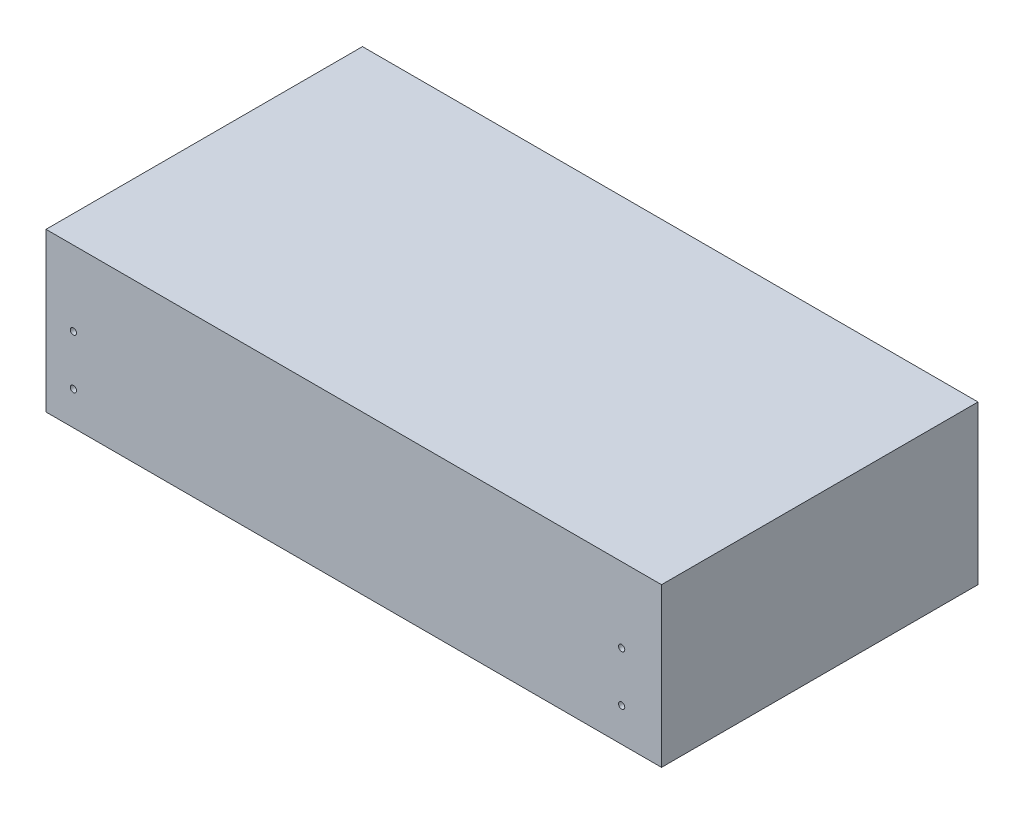
ISO-10303-21;
HEADER;
FILE_DESCRIPTION(('STEP AP214'),'2;1');
FILE_NAME('part.step','',(''),(''),'','','');
FILE_SCHEMA(('AUTOMOTIVE_DESIGN { 1 0 10303 214 1 1 1 1 }'));
ENDSEC;
DATA;
#1=APPLICATION_CONTEXT('core data for automotive mechanical design processes');
#2=APPLICATION_PROTOCOL_DEFINITION('international standard','automotive_design',2000,#1);
#3=PRODUCT_CONTEXT('',#1,'mechanical');
#4=PRODUCT('Part','Part','',(#3));
#5=PRODUCT_RELATED_PRODUCT_CATEGORY('part','',(#4));
#6=PRODUCT_DEFINITION_FORMATION('','',#4);
#7=PRODUCT_DEFINITION_CONTEXT('part definition',#1,'design');
#8=PRODUCT_DEFINITION('design','',#6,#7);
#9=PRODUCT_DEFINITION_SHAPE('','',#8);
#10=(LENGTH_UNIT() NAMED_UNIT(*) SI_UNIT(.MILLI.,.METRE.));
#11=(NAMED_UNIT(*) PLANE_ANGLE_UNIT() SI_UNIT($,.RADIAN.));
#12=(NAMED_UNIT(*) SI_UNIT($,.STERADIAN.) SOLID_ANGLE_UNIT());
#13=UNCERTAINTY_MEASURE_WITH_UNIT(LENGTH_MEASURE(1.E-05),#10,'distance_accuracy_value','');
#14=(GEOMETRIC_REPRESENTATION_CONTEXT(3) GLOBAL_UNCERTAINTY_ASSIGNED_CONTEXT((#13)) GLOBAL_UNIT_ASSIGNED_CONTEXT((#10,
#11,#12)) REPRESENTATION_CONTEXT('',''));
#15=CARTESIAN_POINT('',(0.,0.,0.));
#16=DIRECTION('',(0.,0.,1.));
#17=DIRECTION('',(1.,0.,0.));
#18=AXIS2_PLACEMENT_3D('',#15,#16,#17);
#19=CARTESIAN_POINT('',(-128.5,0.,0.));
#20=DIRECTION('',(1.,0.,0.));
#21=DIRECTION('',(0.,0.,-1.));
#22=AXIS2_PLACEMENT_3D('',#19,#20,#21);
#23=PLANE('',#22);
#24=DIRECTION('',(0.,-1.,0.));
#25=VECTOR('',#24,1.);
#26=CARTESIAN_POINT('',(-128.5,18.35,41.0916666666667));
#27=LINE('',#26,#25);
#28=CARTESIAN_POINT('',(-128.5,18.35,41.0916666666667));
#29=VERTEX_POINT('',#28);
#30=CARTESIAN_POINT('',(-128.5,12.,41.0916666666667));
#31=VERTEX_POINT('',#30);
#32=EDGE_CURVE('E218',#29,#31,#27,.T.);
#33=ORIENTED_EDGE('',*,*,#32,.F.);
#34=DIRECTION('',(0.,0.,-1.));
#35=VECTOR('',#34,1.);
#36=CARTESIAN_POINT('',(-128.5,18.35,29.45));
#37=LINE('',#36,#35);
#38=CARTESIAN_POINT('',(-128.5,18.35,36.8583333333334));
#39=VERTEX_POINT('',#38);
#40=EDGE_CURVE('E297',#29,#39,#37,.T.);
#41=ORIENTED_EDGE('',*,*,#40,.T.);
#42=DIRECTION('',(0.,1.,0.));
#43=VECTOR('',#42,1.);
#44=CARTESIAN_POINT('',(-128.5,18.35,36.8583333333334));
#45=LINE('',#44,#43);
#46=CARTESIAN_POINT('',(-128.5,12.,36.8583333333334));
#47=VERTEX_POINT('',#46);
#48=EDGE_CURVE('E248',#47,#39,#45,.T.);
#49=ORIENTED_EDGE('',*,*,#48,.F.);
#50=DIRECTION('',(0.,0.,1.));
#51=VECTOR('',#50,1.);
#52=CARTESIAN_POINT('',(-128.5,12.,29.45));
#53=LINE('',#52,#51);
#54=EDGE_CURVE('E57',#47,#31,#53,.T.);
#55=ORIENTED_EDGE('',*,*,#54,.T.);
#56=EDGE_LOOP('',(#33,#41,#49,#55));
#57=FACE_BOUND('',#56,.T.);
#58=ADVANCED_FACE('F34',(#57),#23,.F.);
#59=DIRECTION('',(0.,1.,0.));
#60=VECTOR('',#59,1.);
#61=CARTESIAN_POINT('',(-128.5,18.35,42.6791666666667));
#62=LINE('',#61,#60);
#63=CARTESIAN_POINT('',(-128.5,12.,42.6791666666667));
#64=VERTEX_POINT('',#63);
#65=CARTESIAN_POINT('',(-128.5,18.35,42.6791666666667));
#66=VERTEX_POINT('',#65);
#67=EDGE_CURVE('E49',#64,#66,#62,.T.);
#68=ORIENTED_EDGE('',*,*,#67,.F.);
#69=CARTESIAN_POINT('',(-128.5,12.,46.9125));
#70=VERTEX_POINT('',#69);
#71=EDGE_CURVE('E293',#64,#70,#53,.T.);
#72=ORIENTED_EDGE('',*,*,#71,.T.);
#73=DIRECTION('',(0.,-1.,0.));
#74=VECTOR('',#73,1.);
#75=CARTESIAN_POINT('',(-128.5,18.35,46.9125));
#76=LINE('',#75,#74);
#77=CARTESIAN_POINT('',(-128.5,18.35,46.9125));
#78=VERTEX_POINT('',#77);
#79=EDGE_CURVE('E219',#78,#70,#76,.T.);
#80=ORIENTED_EDGE('',*,*,#79,.F.);
#81=EDGE_CURVE('E294',#78,#66,#37,.T.);
#82=ORIENTED_EDGE('',*,*,#81,.T.);
#83=EDGE_LOOP('',(#68,#72,#80,#82));
#84=FACE_BOUND('',#83,.T.);
#85=ADVANCED_FACE('F424',(#84),#23,.F.);
#86=DIRECTION('',(0.,-1.,0.));
#87=VECTOR('',#86,1.);
#88=CARTESIAN_POINT('',(-128.5,18.35,35.2708333333334));
#89=LINE('',#88,#87);
#90=CARTESIAN_POINT('',(-128.5,18.35,35.2708333333334));
#91=VERTEX_POINT('',#90);
#92=CARTESIAN_POINT('',(-128.5,12.,35.2708333333334));
#93=VERTEX_POINT('',#92);
#94=EDGE_CURVE('E243',#91,#93,#89,.T.);
#95=ORIENTED_EDGE('',*,*,#94,.F.);
#96=CARTESIAN_POINT('',(-128.5,18.35,31.0375));
#97=VERTEX_POINT('',#96);
#98=EDGE_CURVE('E292',#91,#97,#37,.T.);
#99=ORIENTED_EDGE('',*,*,#98,.T.);
#100=DIRECTION('',(0.,1.,0.));
#101=VECTOR('',#100,1.);
#102=CARTESIAN_POINT('',(-128.5,18.35,31.0375));
#103=LINE('',#102,#101);
#104=CARTESIAN_POINT('',(-128.5,12.,31.0375));
#105=VERTEX_POINT('',#104);
#106=EDGE_CURVE('E270',#105,#97,#103,.T.);
#107=ORIENTED_EDGE('',*,*,#106,.F.);
#108=EDGE_CURVE('E290',#105,#93,#53,.T.);
#109=ORIENTED_EDGE('',*,*,#108,.T.);
#110=EDGE_LOOP('',(#95,#99,#107,#109));
#111=FACE_BOUND('',#110,.T.);
#112=ADVANCED_FACE('F420',(#111),#23,.F.);
#113=CARTESIAN_POINT('',(-123.5,63.5,63.5));
#114=DIRECTION('',(1.,0.,0.));
#115=DIRECTION('',(0.,0.,-1.));
#116=AXIS2_PLACEMENT_3D('',#113,#114,#115);
#117=PLANE('',#116);
#118=DIRECTION('',(0.,0.,1.));
#119=VECTOR('',#118,1.);
#120=CARTESIAN_POINT('',(-123.5,0.,63.5));
#121=LINE('',#120,#119);
#122=CARTESIAN_POINT('',(-123.5,0.,-63.5));
#123=VERTEX_POINT('',#122);
#124=CARTESIAN_POINT('',(-123.5,0.,63.5));
#125=VERTEX_POINT('',#124);
#126=EDGE_CURVE('E367',#123,#125,#121,.T.);
#127=ORIENTED_EDGE('',*,*,#126,.T.);
#128=DIRECTION('',(0.,-1.,0.));
#129=VECTOR('',#128,1.);
#130=CARTESIAN_POINT('',(-123.5,63.5,63.5));
#131=LINE('',#130,#129);
#132=CARTESIAN_POINT('',(-123.5,63.5,63.5));
#133=VERTEX_POINT('',#132);
#134=EDGE_CURVE('E11',#133,#125,#131,.T.);
#135=ORIENTED_EDGE('',*,*,#134,.F.);
#136=DIRECTION('',(0.,0.,1.));
#137=VECTOR('',#136,1.);
#138=CARTESIAN_POINT('',(-123.5,63.5,63.5));
#139=LINE('',#138,#137);
#140=CARTESIAN_POINT('',(-123.5,63.5,-63.5));
#141=VERTEX_POINT('',#140);
#142=EDGE_CURVE('E368',#141,#133,#139,.T.);
#143=ORIENTED_EDGE('',*,*,#142,.F.);
#144=DIRECTION('',(0.,-1.,0.));
#145=VECTOR('',#144,1.);
#146=CARTESIAN_POINT('',(-123.5,63.5,-63.5));
#147=LINE('',#146,#145);
#148=EDGE_CURVE('E378',#141,#123,#147,.T.);
#149=ORIENTED_EDGE('',*,*,#148,.T.);
#150=EDGE_LOOP('',(#127,#135,#143,#149));
#151=FACE_BOUND('',#150,.T.);
#152=DIRECTION('',(0.,-1.,0.));
#153=VECTOR('',#152,1.);
#154=CARTESIAN_POINT('',(-123.5,12.,29.45));
#155=LINE('',#154,#153);
#156=CARTESIAN_POINT('',(-123.5,18.35,29.45));
#157=VERTEX_POINT('',#156);
#158=CARTESIAN_POINT('',(-123.5,12.,29.45));
#159=VERTEX_POINT('',#158);
#160=EDGE_CURVE('E289',#157,#159,#155,.T.);
#161=ORIENTED_EDGE('',*,*,#160,.F.);
#162=DIRECTION('',(0.,0.,-1.));
#163=VECTOR('',#162,1.);
#164=CARTESIAN_POINT('',(-123.5,18.35,29.45));
#165=LINE('',#164,#163);
#166=CARTESIAN_POINT('',(-123.5,18.35,48.5));
#167=VERTEX_POINT('',#166);
#168=EDGE_CURVE('E305',#167,#157,#165,.T.);
#169=ORIENTED_EDGE('',*,*,#168,.F.);
#170=DIRECTION('',(0.,1.,0.));
#171=VECTOR('',#170,1.);
#172=CARTESIAN_POINT('',(-123.5,12.,48.5));
#173=LINE('',#172,#171);
#174=CARTESIAN_POINT('',(-123.5,12.,48.5));
#175=VERTEX_POINT('',#174);
#176=EDGE_CURVE('E302',#175,#167,#173,.T.);
#177=ORIENTED_EDGE('',*,*,#176,.F.);
#178=DIRECTION('',(0.,0.,1.));
#179=VECTOR('',#178,1.);
#180=CARTESIAN_POINT('',(-123.5,12.,29.45));
#181=LINE('',#180,#179);
#182=EDGE_CURVE('E300',#159,#175,#181,.T.);
#183=ORIENTED_EDGE('',*,*,#182,.F.);
#184=EDGE_LOOP('',(#161,#169,#177,#183));
#185=FACE_BOUND('',#184,.T.);
#186=ADVANCED_FACE('F36',(#151,#185),#117,.F.);
#187=CARTESIAN_POINT('',(-123.5,63.5,63.5));
#188=DIRECTION('',(0.,0.,-1.));
#189=DIRECTION('',(-1.,0.,0.));
#190=AXIS2_PLACEMENT_3D('',#187,#188,#189);
#191=PLANE('',#190);
#192=CARTESIAN_POINT('',(-112.5,33.5,63.5));
#193=DIRECTION('',(0.,0.,1.));
#194=DIRECTION('',(1.,0.,0.));
#195=AXIS2_PLACEMENT_3D('',#192,#193,#194);
#196=CIRCLE('',#195,1.24999999999999);
#197=CARTESIAN_POINT('',(-111.25,33.5,63.5));
#198=VERTEX_POINT('',#197);
#199=EDGE_CURVE('E343',#198,#198,#196,.T.);
#200=ORIENTED_EDGE('',*,*,#199,.F.);
#201=EDGE_LOOP('',(#200));
#202=FACE_BOUND('',#201,.T.);
#203=CARTESIAN_POINT('',(-112.5,13.5,63.5));
#204=DIRECTION('',(0.,0.,1.));
#205=DIRECTION('',(1.,0.,0.));
#206=AXIS2_PLACEMENT_3D('',#203,#204,#205);
#207=CIRCLE('',#206,1.24999999999999);
#208=CARTESIAN_POINT('',(-111.25,13.5,63.5));
#209=VERTEX_POINT('',#208);
#210=EDGE_CURVE('E349',#209,#209,#207,.T.);
#211=ORIENTED_EDGE('',*,*,#210,.F.);
#212=EDGE_LOOP('',(#211));
#213=FACE_BOUND('',#212,.T.);
#214=CARTESIAN_POINT('',(107.5,13.5,63.5));
#215=DIRECTION('',(0.,0.,1.));
#216=DIRECTION('',(1.,0.,0.));
#217=AXIS2_PLACEMENT_3D('',#214,#215,#216);
#218=CIRCLE('',#217,1.24999999999999);
#219=CARTESIAN_POINT('',(108.75,13.5,63.5));
#220=VERTEX_POINT('',#219);
#221=EDGE_CURVE('E355',#220,#220,#218,.T.);
#222=ORIENTED_EDGE('',*,*,#221,.F.);
#223=EDGE_LOOP('',(#222));
#224=FACE_BOUND('',#223,.T.);
#225=CARTESIAN_POINT('',(107.5,33.5,63.5));
#226=DIRECTION('',(0.,0.,1.));
#227=DIRECTION('',(1.,0.,0.));
#228=AXIS2_PLACEMENT_3D('',#225,#226,#227);
#229=CIRCLE('',#228,1.24999999999999);
#230=CARTESIAN_POINT('',(108.75,33.5,63.5));
#231=VERTEX_POINT('',#230);
#232=EDGE_CURVE('E361',#231,#231,#229,.T.);
#233=ORIENTED_EDGE('',*,*,#232,.F.);
#234=EDGE_LOOP('',(#233));
#235=FACE_BOUND('',#234,.T.);
#236=DIRECTION('',(1.,0.,0.));
#237=VECTOR('',#236,1.);
#238=CARTESIAN_POINT('',(-123.5,0.,63.5));
#239=LINE('',#238,#237);
#240=CARTESIAN_POINT('',(123.5,0.,63.5));
#241=VERTEX_POINT('',#240);
#242=EDGE_CURVE('E381',#125,#241,#239,.T.);
#243=ORIENTED_EDGE('',*,*,#242,.T.);
#244=DIRECTION('',(0.,-1.,0.));
#245=VECTOR('',#244,1.);
#246=CARTESIAN_POINT('',(123.5,63.5,63.5));
#247=LINE('',#246,#245);
#248=CARTESIAN_POINT('',(123.5,63.5,63.5));
#249=VERTEX_POINT('',#248);
#250=EDGE_CURVE('E42',#249,#241,#247,.T.);
#251=ORIENTED_EDGE('',*,*,#250,.F.);
#252=DIRECTION('',(1.,0.,0.));
#253=VECTOR('',#252,1.);
#254=CARTESIAN_POINT('',(-123.5,63.5,63.5));
#255=LINE('',#254,#253);
#256=EDGE_CURVE('E371',#133,#249,#255,.T.);
#257=ORIENTED_EDGE('',*,*,#256,.F.);
#258=ORIENTED_EDGE('',*,*,#134,.T.);
#259=EDGE_LOOP('',(#243,#251,#257,#258));
#260=FACE_BOUND('',#259,.T.);
#261=ADVANCED_FACE('F412',(#202,#213,#224,#235,#260),#191,.F.);
#262=CARTESIAN_POINT('',(123.5,63.5,63.5));
#263=DIRECTION('',(-1.,0.,0.));
#264=DIRECTION('',(0.,0.,1.));
#265=AXIS2_PLACEMENT_3D('',#262,#263,#264);
#266=PLANE('',#265);
#267=DIRECTION('',(0.,0.,-1.));
#268=VECTOR('',#267,1.);
#269=CARTESIAN_POINT('',(123.5,0.,63.5));
#270=LINE('',#269,#268);
#271=CARTESIAN_POINT('',(123.5,0.,-63.5));
#272=VERTEX_POINT('',#271);
#273=EDGE_CURVE('E383',#241,#272,#270,.T.);
#274=ORIENTED_EDGE('',*,*,#273,.T.);
#275=DIRECTION('',(0.,-1.,0.));
#276=VECTOR('',#275,1.);
#277=CARTESIAN_POINT('',(123.5,63.5,-63.5));
#278=LINE('',#277,#276);
#279=CARTESIAN_POINT('',(123.5,63.5,-63.5));
#280=VERTEX_POINT('',#279);
#281=EDGE_CURVE('E388',#280,#272,#278,.T.);
#282=ORIENTED_EDGE('',*,*,#281,.F.);
#283=DIRECTION('',(0.,0.,-1.));
#284=VECTOR('',#283,1.);
#285=CARTESIAN_POINT('',(123.5,63.5,63.5));
#286=LINE('',#285,#284);
#287=EDGE_CURVE('E374',#249,#280,#286,.T.);
#288=ORIENTED_EDGE('',*,*,#287,.F.);
#289=ORIENTED_EDGE('',*,*,#250,.T.);
#290=EDGE_LOOP('',(#274,#282,#288,#289));
#291=FACE_BOUND('',#290,.T.);
#292=ADVANCED_FACE('F395',(#291),#266,.F.);
#293=CARTESIAN_POINT('',(-123.5,63.5,-63.5));
#294=DIRECTION('',(0.,0.,1.));
#295=DIRECTION('',(1.,0.,0.));
#296=AXIS2_PLACEMENT_3D('',#293,#294,#295);
#297=PLANE('',#296);
#298=CARTESIAN_POINT('',(-112.5,33.5,-63.5));
#299=DIRECTION('',(0.,0.,-1.));
#300=DIRECTION('',(-1.,0.,0.));
#301=AXIS2_PLACEMENT_3D('',#298,#299,#300);
#302=CIRCLE('',#301,1.24999999999999);
#303=CARTESIAN_POINT('',(-113.75,33.5,-63.5));
#304=VERTEX_POINT('',#303);
#305=EDGE_CURVE('E319',#304,#304,#302,.T.);
#306=ORIENTED_EDGE('',*,*,#305,.F.);
#307=EDGE_LOOP('',(#306));
#308=FACE_BOUND('',#307,.T.);
#309=CARTESIAN_POINT('',(-112.5,13.5,-63.5));
#310=DIRECTION('',(0.,0.,-1.));
#311=DIRECTION('',(-1.,0.,0.));
#312=AXIS2_PLACEMENT_3D('',#309,#310,#311);
#313=CIRCLE('',#312,1.24999999999999);
#314=CARTESIAN_POINT('',(-113.75,13.5,-63.5));
#315=VERTEX_POINT('',#314);
#316=EDGE_CURVE('E325',#315,#315,#313,.T.);
#317=ORIENTED_EDGE('',*,*,#316,.F.);
#318=EDGE_LOOP('',(#317));
#319=FACE_BOUND('',#318,.T.);
#320=CARTESIAN_POINT('',(107.5,13.5,-63.5));
#321=DIRECTION('',(0.,0.,-1.));
#322=DIRECTION('',(-1.,0.,0.));
#323=AXIS2_PLACEMENT_3D('',#320,#321,#322);
#324=CIRCLE('',#323,1.24999999999999);
#325=CARTESIAN_POINT('',(106.25,13.5,-63.5));
#326=VERTEX_POINT('',#325);
#327=EDGE_CURVE('E331',#326,#326,#324,.T.);
#328=ORIENTED_EDGE('',*,*,#327,.F.);
#329=EDGE_LOOP('',(#328));
#330=FACE_BOUND('',#329,.T.);
#331=CARTESIAN_POINT('',(107.5,33.5,-63.5));
#332=DIRECTION('',(0.,0.,-1.));
#333=DIRECTION('',(-1.,0.,0.));
#334=AXIS2_PLACEMENT_3D('',#331,#332,#333);
#335=CIRCLE('',#334,1.24999999999999);
#336=CARTESIAN_POINT('',(106.25,33.5,-63.5));
#337=VERTEX_POINT('',#336);
#338=EDGE_CURVE('E337',#337,#337,#335,.T.);
#339=ORIENTED_EDGE('',*,*,#338,.F.);
#340=EDGE_LOOP('',(#339));
#341=FACE_BOUND('',#340,.T.);
#342=DIRECTION('',(-1.,0.,0.));
#343=VECTOR('',#342,1.);
#344=CARTESIAN_POINT('',(-123.5,0.,-63.5));
#345=LINE('',#344,#343);
#346=EDGE_CURVE('E372',#272,#123,#345,.T.);
#347=ORIENTED_EDGE('',*,*,#346,.T.);
#348=ORIENTED_EDGE('',*,*,#148,.F.);
#349=DIRECTION('',(-1.,0.,0.));
#350=VECTOR('',#349,1.);
#351=CARTESIAN_POINT('',(-123.5,63.5,-63.5));
#352=LINE('',#351,#350);
#353=EDGE_CURVE('E376',#280,#141,#352,.T.);
#354=ORIENTED_EDGE('',*,*,#353,.F.);
#355=ORIENTED_EDGE('',*,*,#281,.T.);
#356=EDGE_LOOP('',(#347,#348,#354,#355));
#357=FACE_BOUND('',#356,.T.);
#358=ADVANCED_FACE('F404',(#308,#319,#330,#341,#357),#297,.F.);
#359=CARTESIAN_POINT('',(0.,63.5,0.));
#360=DIRECTION('',(0.,-1.,0.));
#361=DIRECTION('',(0.,0.,-1.));
#362=AXIS2_PLACEMENT_3D('',#359,#360,#361);
#363=PLANE('',#362);
#364=ORIENTED_EDGE('',*,*,#142,.T.);
#365=ORIENTED_EDGE('',*,*,#256,.T.);
#366=ORIENTED_EDGE('',*,*,#287,.T.);
#367=ORIENTED_EDGE('',*,*,#353,.T.);
#368=EDGE_LOOP('',(#364,#365,#366,#367));
#369=FACE_BOUND('',#368,.T.);
#370=ADVANCED_FACE('F411',(#369),#363,.F.);
#371=CARTESIAN_POINT('',(0.,0.,0.));
#372=DIRECTION('',(0.,-1.,0.));
#373=DIRECTION('',(0.,0.,-1.));
#374=AXIS2_PLACEMENT_3D('',#371,#372,#373);
#375=PLANE('',#374);
#376=ORIENTED_EDGE('',*,*,#126,.F.);
#377=ORIENTED_EDGE('',*,*,#346,.F.);
#378=ORIENTED_EDGE('',*,*,#273,.F.);
#379=ORIENTED_EDGE('',*,*,#242,.F.);
#380=EDGE_LOOP('',(#376,#377,#378,#379));
#381=FACE_BOUND('',#380,.T.);
#382=ADVANCED_FACE('F401',(#381),#375,.T.);
#383=CARTESIAN_POINT('',(107.5,33.5,59.5));
#384=DIRECTION('',(0.,0.,1.));
#385=DIRECTION('',(1.,0.,0.));
#386=AXIS2_PLACEMENT_3D('',#383,#384,#385);
#387=CONICAL_SURFACE('',#386,1.25,1.02974425867666);
#388=CARTESIAN_POINT('',(107.5,33.5,58.7489242262156));
#389=VERTEX_POINT('',#388);
#390=VERTEX_LOOP('',#389);
#391=FACE_BOUND('',#390,.T.);
#392=CARTESIAN_POINT('',(107.5,33.5,59.5));
#393=DIRECTION('',(0.,0.,1.));
#394=DIRECTION('',(1.,0.,0.));
#395=AXIS2_PLACEMENT_3D('',#392,#393,#394);
#396=CIRCLE('',#395,1.25);
#397=CARTESIAN_POINT('',(108.75,33.5,59.5));
#398=VERTEX_POINT('',#397);
#399=EDGE_CURVE('E364',#398,#398,#396,.T.);
#400=ORIENTED_EDGE('',*,*,#399,.T.);
#401=EDGE_LOOP('',(#400));
#402=FACE_BOUND('',#401,.T.);
#403=ADVANCED_FACE('F578',(#391,#402),#387,.F.);
#404=CARTESIAN_POINT('',(107.5,33.5,63.5));
#405=DIRECTION('',(0.,0.,1.));
#406=DIRECTION('',(1.,0.,0.));
#407=AXIS2_PLACEMENT_3D('',#404,#405,#406);
#408=CYLINDRICAL_SURFACE('',#407,1.24999999999999);
#409=ORIENTED_EDGE('',*,*,#399,.F.);
#410=EDGE_LOOP('',(#409));
#411=FACE_BOUND('',#410,.T.);
#412=ORIENTED_EDGE('',*,*,#232,.T.);
#413=EDGE_LOOP('',(#412));
#414=FACE_BOUND('',#413,.T.);
#415=ADVANCED_FACE('F574',(#411,#414),#408,.F.);
#416=CARTESIAN_POINT('',(107.5,13.5,59.5));
#417=DIRECTION('',(0.,0.,1.));
#418=DIRECTION('',(1.,0.,0.));
#419=AXIS2_PLACEMENT_3D('',#416,#417,#418);
#420=CONICAL_SURFACE('',#419,1.25,1.02974425867666);
#421=CARTESIAN_POINT('',(107.5,13.5,58.7489242262156));
#422=VERTEX_POINT('',#421);
#423=VERTEX_LOOP('',#422);
#424=FACE_BOUND('',#423,.T.);
#425=CARTESIAN_POINT('',(107.5,13.5,59.5));
#426=DIRECTION('',(0.,0.,1.));
#427=DIRECTION('',(1.,0.,0.));
#428=AXIS2_PLACEMENT_3D('',#425,#426,#427);
#429=CIRCLE('',#428,1.25);
#430=CARTESIAN_POINT('',(108.75,13.5,59.5));
#431=VERTEX_POINT('',#430);
#432=EDGE_CURVE('E358',#431,#431,#429,.T.);
#433=ORIENTED_EDGE('',*,*,#432,.T.);
#434=EDGE_LOOP('',(#433));
#435=FACE_BOUND('',#434,.T.);
#436=ADVANCED_FACE('F570',(#424,#435),#420,.F.);
#437=CARTESIAN_POINT('',(107.5,13.5,63.5));
#438=DIRECTION('',(0.,0.,1.));
#439=DIRECTION('',(1.,0.,0.));
#440=AXIS2_PLACEMENT_3D('',#437,#438,#439);
#441=CYLINDRICAL_SURFACE('',#440,1.24999999999999);
#442=ORIENTED_EDGE('',*,*,#432,.F.);
#443=EDGE_LOOP('',(#442));
#444=FACE_BOUND('',#443,.T.);
#445=ORIENTED_EDGE('',*,*,#221,.T.);
#446=EDGE_LOOP('',(#445));
#447=FACE_BOUND('',#446,.T.);
#448=ADVANCED_FACE('F566',(#444,#447),#441,.F.);
#449=CARTESIAN_POINT('',(-112.5,13.5,59.5));
#450=DIRECTION('',(0.,0.,1.));
#451=DIRECTION('',(1.,0.,0.));
#452=AXIS2_PLACEMENT_3D('',#449,#450,#451);
#453=CONICAL_SURFACE('',#452,1.25,1.02974425867666);
#454=CARTESIAN_POINT('',(-112.5,13.5,58.7489242262156));
#455=VERTEX_POINT('',#454);
#456=VERTEX_LOOP('',#455);
#457=FACE_BOUND('',#456,.T.);
#458=CARTESIAN_POINT('',(-112.5,13.5,59.5));
#459=DIRECTION('',(0.,0.,1.));
#460=DIRECTION('',(1.,0.,0.));
#461=AXIS2_PLACEMENT_3D('',#458,#459,#460);
#462=CIRCLE('',#461,1.25);
#463=CARTESIAN_POINT('',(-111.25,13.5,59.5));
#464=VERTEX_POINT('',#463);
#465=EDGE_CURVE('E352',#464,#464,#462,.T.);
#466=ORIENTED_EDGE('',*,*,#465,.T.);
#467=EDGE_LOOP('',(#466));
#468=FACE_BOUND('',#467,.T.);
#469=ADVANCED_FACE('F562',(#457,#468),#453,.F.);
#470=CARTESIAN_POINT('',(-112.5,13.5,63.5));
#471=DIRECTION('',(0.,0.,1.));
#472=DIRECTION('',(1.,0.,0.));
#473=AXIS2_PLACEMENT_3D('',#470,#471,#472);
#474=CYLINDRICAL_SURFACE('',#473,1.24999999999999);
#475=ORIENTED_EDGE('',*,*,#465,.F.);
#476=EDGE_LOOP('',(#475));
#477=FACE_BOUND('',#476,.T.);
#478=ORIENTED_EDGE('',*,*,#210,.T.);
#479=EDGE_LOOP('',(#478));
#480=FACE_BOUND('',#479,.T.);
#481=ADVANCED_FACE('F558',(#477,#480),#474,.F.);
#482=CARTESIAN_POINT('',(-112.5,33.5,59.5));
#483=DIRECTION('',(0.,0.,1.));
#484=DIRECTION('',(1.,0.,0.));
#485=AXIS2_PLACEMENT_3D('',#482,#483,#484);
#486=CONICAL_SURFACE('',#485,1.25,1.02974425867666);
#487=CARTESIAN_POINT('',(-112.5,33.5,58.7489242262156));
#488=VERTEX_POINT('',#487);
#489=VERTEX_LOOP('',#488);
#490=FACE_BOUND('',#489,.T.);
#491=CARTESIAN_POINT('',(-112.5,33.5,59.5));
#492=DIRECTION('',(0.,0.,1.));
#493=DIRECTION('',(1.,0.,0.));
#494=AXIS2_PLACEMENT_3D('',#491,#492,#493);
#495=CIRCLE('',#494,1.25);
#496=CARTESIAN_POINT('',(-111.25,33.5,59.5));
#497=VERTEX_POINT('',#496);
#498=EDGE_CURVE('E346',#497,#497,#495,.T.);
#499=ORIENTED_EDGE('',*,*,#498,.T.);
#500=EDGE_LOOP('',(#499));
#501=FACE_BOUND('',#500,.T.);
#502=ADVANCED_FACE('F554',(#490,#501),#486,.F.);
#503=CARTESIAN_POINT('',(-112.5,33.5,63.5));
#504=DIRECTION('',(0.,0.,1.));
#505=DIRECTION('',(1.,0.,0.));
#506=AXIS2_PLACEMENT_3D('',#503,#504,#505);
#507=CYLINDRICAL_SURFACE('',#506,1.24999999999999);
#508=ORIENTED_EDGE('',*,*,#498,.F.);
#509=EDGE_LOOP('',(#508));
#510=FACE_BOUND('',#509,.T.);
#511=ORIENTED_EDGE('',*,*,#199,.T.);
#512=EDGE_LOOP('',(#511));
#513=FACE_BOUND('',#512,.T.);
#514=ADVANCED_FACE('F550',(#510,#513),#507,.F.);
#515=CARTESIAN_POINT('',(107.5,33.5,-59.5));
#516=DIRECTION('',(0.,0.,-1.));
#517=DIRECTION('',(-1.,0.,0.));
#518=AXIS2_PLACEMENT_3D('',#515,#516,#517);
#519=CONICAL_SURFACE('',#518,1.25,1.02974425867666);
#520=CARTESIAN_POINT('',(107.5,33.5,-58.7489242262156));
#521=VERTEX_POINT('',#520);
#522=VERTEX_LOOP('',#521);
#523=FACE_BOUND('',#522,.T.);
#524=CARTESIAN_POINT('',(107.5,33.5,-59.5));
#525=DIRECTION('',(0.,0.,-1.));
#526=DIRECTION('',(-1.,0.,0.));
#527=AXIS2_PLACEMENT_3D('',#524,#525,#526);
#528=CIRCLE('',#527,1.25);
#529=CARTESIAN_POINT('',(106.25,33.5,-59.5));
#530=VERTEX_POINT('',#529);
#531=EDGE_CURVE('E340',#530,#530,#528,.T.);
#532=ORIENTED_EDGE('',*,*,#531,.T.);
#533=EDGE_LOOP('',(#532));
#534=FACE_BOUND('',#533,.T.);
#535=ADVANCED_FACE('F546',(#523,#534),#519,.F.);
#536=CARTESIAN_POINT('',(107.5,33.5,-63.5));
#537=DIRECTION('',(0.,0.,-1.));
#538=DIRECTION('',(-1.,0.,0.));
#539=AXIS2_PLACEMENT_3D('',#536,#537,#538);
#540=CYLINDRICAL_SURFACE('',#539,1.24999999999999);
#541=ORIENTED_EDGE('',*,*,#531,.F.);
#542=EDGE_LOOP('',(#541));
#543=FACE_BOUND('',#542,.T.);
#544=ORIENTED_EDGE('',*,*,#338,.T.);
#545=EDGE_LOOP('',(#544));
#546=FACE_BOUND('',#545,.T.);
#547=ADVANCED_FACE('F542',(#543,#546),#540,.F.);
#548=CARTESIAN_POINT('',(107.5,13.5,-59.5));
#549=DIRECTION('',(0.,0.,-1.));
#550=DIRECTION('',(-1.,0.,0.));
#551=AXIS2_PLACEMENT_3D('',#548,#549,#550);
#552=CONICAL_SURFACE('',#551,1.25,1.02974425867666);
#553=CARTESIAN_POINT('',(107.5,13.5,-58.7489242262156));
#554=VERTEX_POINT('',#553);
#555=VERTEX_LOOP('',#554);
#556=FACE_BOUND('',#555,.T.);
#557=CARTESIAN_POINT('',(107.5,13.5,-59.5));
#558=DIRECTION('',(0.,0.,-1.));
#559=DIRECTION('',(-1.,0.,0.));
#560=AXIS2_PLACEMENT_3D('',#557,#558,#559);
#561=CIRCLE('',#560,1.25);
#562=CARTESIAN_POINT('',(106.25,13.5,-59.5));
#563=VERTEX_POINT('',#562);
#564=EDGE_CURVE('E334',#563,#563,#561,.T.);
#565=ORIENTED_EDGE('',*,*,#564,.T.);
#566=EDGE_LOOP('',(#565));
#567=FACE_BOUND('',#566,.T.);
#568=ADVANCED_FACE('F538',(#556,#567),#552,.F.);
#569=CARTESIAN_POINT('',(107.5,13.5,-63.5));
#570=DIRECTION('',(0.,0.,-1.));
#571=DIRECTION('',(-1.,0.,0.));
#572=AXIS2_PLACEMENT_3D('',#569,#570,#571);
#573=CYLINDRICAL_SURFACE('',#572,1.24999999999999);
#574=ORIENTED_EDGE('',*,*,#564,.F.);
#575=EDGE_LOOP('',(#574));
#576=FACE_BOUND('',#575,.T.);
#577=ORIENTED_EDGE('',*,*,#327,.T.);
#578=EDGE_LOOP('',(#577));
#579=FACE_BOUND('',#578,.T.);
#580=ADVANCED_FACE('F534',(#576,#579),#573,.F.);
#581=CARTESIAN_POINT('',(-112.5,13.5,-59.5));
#582=DIRECTION('',(0.,0.,-1.));
#583=DIRECTION('',(-1.,0.,0.));
#584=AXIS2_PLACEMENT_3D('',#581,#582,#583);
#585=CONICAL_SURFACE('',#584,1.25,1.02974425867666);
#586=CARTESIAN_POINT('',(-112.5,13.5,-58.7489242262156));
#587=VERTEX_POINT('',#586);
#588=VERTEX_LOOP('',#587);
#589=FACE_BOUND('',#588,.T.);
#590=CARTESIAN_POINT('',(-112.5,13.5,-59.5));
#591=DIRECTION('',(0.,0.,-1.));
#592=DIRECTION('',(-1.,0.,0.));
#593=AXIS2_PLACEMENT_3D('',#590,#591,#592);
#594=CIRCLE('',#593,1.25);
#595=CARTESIAN_POINT('',(-113.75,13.5,-59.5));
#596=VERTEX_POINT('',#595);
#597=EDGE_CURVE('E328',#596,#596,#594,.T.);
#598=ORIENTED_EDGE('',*,*,#597,.T.);
#599=EDGE_LOOP('',(#598));
#600=FACE_BOUND('',#599,.T.);
#601=ADVANCED_FACE('F530',(#589,#600),#585,.F.);
#602=CARTESIAN_POINT('',(-112.5,13.5,-63.5));
#603=DIRECTION('',(0.,0.,-1.));
#604=DIRECTION('',(-1.,0.,0.));
#605=AXIS2_PLACEMENT_3D('',#602,#603,#604);
#606=CYLINDRICAL_SURFACE('',#605,1.24999999999999);
#607=ORIENTED_EDGE('',*,*,#597,.F.);
#608=EDGE_LOOP('',(#607));
#609=FACE_BOUND('',#608,.T.);
#610=ORIENTED_EDGE('',*,*,#316,.T.);
#611=EDGE_LOOP('',(#610));
#612=FACE_BOUND('',#611,.T.);
#613=ADVANCED_FACE('F526',(#609,#612),#606,.F.);
#614=CARTESIAN_POINT('',(-112.5,33.5,-59.5));
#615=DIRECTION('',(0.,0.,-1.));
#616=DIRECTION('',(-1.,0.,0.));
#617=AXIS2_PLACEMENT_3D('',#614,#615,#616);
#618=CONICAL_SURFACE('',#617,1.25,1.02974425867666);
#619=CARTESIAN_POINT('',(-112.5,33.5,-58.7489242262156));
#620=VERTEX_POINT('',#619);
#621=VERTEX_LOOP('',#620);
#622=FACE_BOUND('',#621,.T.);
#623=CARTESIAN_POINT('',(-112.5,33.5,-59.5));
#624=DIRECTION('',(0.,0.,-1.));
#625=DIRECTION('',(-1.,0.,0.));
#626=AXIS2_PLACEMENT_3D('',#623,#624,#625);
#627=CIRCLE('',#626,1.25);
#628=CARTESIAN_POINT('',(-113.75,33.5,-59.5));
#629=VERTEX_POINT('',#628);
#630=EDGE_CURVE('E322',#629,#629,#627,.T.);
#631=ORIENTED_EDGE('',*,*,#630,.T.);
#632=EDGE_LOOP('',(#631));
#633=FACE_BOUND('',#632,.T.);
#634=ADVANCED_FACE('F519',(#622,#633),#618,.F.);
#635=CARTESIAN_POINT('',(-112.5,33.5,-63.5));
#636=DIRECTION('',(0.,0.,-1.));
#637=DIRECTION('',(-1.,0.,0.));
#638=AXIS2_PLACEMENT_3D('',#635,#636,#637);
#639=CYLINDRICAL_SURFACE('',#638,1.24999999999999);
#640=ORIENTED_EDGE('',*,*,#630,.F.);
#641=EDGE_LOOP('',(#640));
#642=FACE_BOUND('',#641,.T.);
#643=ORIENTED_EDGE('',*,*,#305,.T.);
#644=EDGE_LOOP('',(#643));
#645=FACE_BOUND('',#644,.T.);
#646=ADVANCED_FACE('F512',(#642,#645),#639,.F.);
#647=CARTESIAN_POINT('',(-128.5,12.,29.45));
#648=DIRECTION('',(0.,0.,1.));
#649=DIRECTION('',(1.,0.,0.));
#650=AXIS2_PLACEMENT_3D('',#647,#648,#649);
#651=PLANE('',#650);
#652=ORIENTED_EDGE('',*,*,#160,.T.);
#653=DIRECTION('',(1.,0.,0.));
#654=VECTOR('',#653,1.);
#655=CARTESIAN_POINT('',(-128.5,12.,29.45));
#656=LINE('',#655,#654);
#657=CARTESIAN_POINT('',(-133.5,12.,29.45));
#658=VERTEX_POINT('',#657);
#659=EDGE_CURVE('E316',#658,#159,#656,.T.);
#660=ORIENTED_EDGE('',*,*,#659,.F.);
#661=DIRECTION('',(0.,-1.,0.));
#662=VECTOR('',#661,1.);
#663=CARTESIAN_POINT('',(-133.5,18.35,29.45));
#664=LINE('',#663,#662);
#665=CARTESIAN_POINT('',(-133.5,18.35,29.45));
#666=VERTEX_POINT('',#665);
#667=EDGE_CURVE('E271',#666,#658,#664,.T.);
#668=ORIENTED_EDGE('',*,*,#667,.F.);
#669=DIRECTION('',(1.,0.,0.));
#670=VECTOR('',#669,1.);
#671=CARTESIAN_POINT('',(-128.5,18.35,29.45));
#672=LINE('',#671,#670);
#673=EDGE_CURVE('E296',#666,#157,#672,.T.);
#674=ORIENTED_EDGE('',*,*,#673,.T.);
#675=EDGE_LOOP('',(#652,#660,#668,#674));
#676=FACE_BOUND('',#675,.T.);
#677=ADVANCED_FACE('F510',(#676),#651,.F.);
#678=CARTESIAN_POINT('',(-128.5,12.,29.45));
#679=DIRECTION('',(0.,1.,0.));
#680=DIRECTION('',(0.,0.,1.));
#681=AXIS2_PLACEMENT_3D('',#678,#679,#680);
#682=PLANE('',#681);
#683=ORIENTED_EDGE('',*,*,#182,.T.);
#684=DIRECTION('',(1.,0.,0.));
#685=VECTOR('',#684,1.);
#686=CARTESIAN_POINT('',(-128.5,12.,48.5));
#687=LINE('',#686,#685);
#688=CARTESIAN_POINT('',(-133.5,12.,48.5));
#689=VERTEX_POINT('',#688);
#690=EDGE_CURVE('E313',#689,#175,#687,.T.);
#691=ORIENTED_EDGE('',*,*,#690,.F.);
#692=DIRECTION('',(0.,0.,1.));
#693=VECTOR('',#692,1.);
#694=CARTESIAN_POINT('',(-133.5,12.,48.5));
#695=LINE('',#694,#693);
#696=CARTESIAN_POINT('',(-133.5,12.,46.9125));
#697=VERTEX_POINT('',#696);
#698=EDGE_CURVE('E234',#697,#689,#695,.T.);
#699=ORIENTED_EDGE('',*,*,#698,.F.);
#700=DIRECTION('',(1.,0.,0.));
#701=VECTOR('',#700,1.);
#702=CARTESIAN_POINT('',(-133.5,12.,46.9125));
#703=LINE('',#702,#701);
#704=EDGE_CURVE('E236',#697,#70,#703,.T.);
#705=ORIENTED_EDGE('',*,*,#704,.T.);
#706=ORIENTED_EDGE('',*,*,#71,.F.);
#707=DIRECTION('',(1.,0.,0.));
#708=VECTOR('',#707,1.);
#709=CARTESIAN_POINT('',(-133.5,12.,42.6791666666667));
#710=LINE('',#709,#708);
#711=CARTESIAN_POINT('',(-133.5,12.,42.6791666666667));
#712=VERTEX_POINT('',#711);
#713=EDGE_CURVE('E203',#712,#64,#710,.T.);
#714=ORIENTED_EDGE('',*,*,#713,.F.);
#715=DIRECTION('',(0.,0.,1.));
#716=VECTOR('',#715,1.);
#717=CARTESIAN_POINT('',(-133.5,12.,41.0916666666667));
#718=LINE('',#717,#716);
#719=CARTESIAN_POINT('',(-133.5,12.,41.0916666666667));
#720=VERTEX_POINT('',#719);
#721=EDGE_CURVE('E195',#720,#712,#718,.T.);
#722=ORIENTED_EDGE('',*,*,#721,.F.);
#723=DIRECTION('',(1.,0.,0.));
#724=VECTOR('',#723,1.);
#725=CARTESIAN_POINT('',(-133.5,12.,41.0916666666667));
#726=LINE('',#725,#724);
#727=EDGE_CURVE('E200',#720,#31,#726,.T.);
#728=ORIENTED_EDGE('',*,*,#727,.T.);
#729=ORIENTED_EDGE('',*,*,#54,.F.);
#730=DIRECTION('',(1.,0.,0.));
#731=VECTOR('',#730,1.);
#732=CARTESIAN_POINT('',(-133.5,12.,36.8583333333334));
#733=LINE('',#732,#731);
#734=CARTESIAN_POINT('',(-133.5,12.,36.8583333333334));
#735=VERTEX_POINT('',#734);
#736=EDGE_CURVE('E264',#735,#47,#733,.T.);
#737=ORIENTED_EDGE('',*,*,#736,.F.);
#738=DIRECTION('',(0.,0.,1.));
#739=VECTOR('',#738,1.);
#740=CARTESIAN_POINT('',(-133.5,12.,35.2708333333334));
#741=LINE('',#740,#739);
#742=CARTESIAN_POINT('',(-133.5,12.,35.2708333333334));
#743=VERTEX_POINT('',#742);
#744=EDGE_CURVE('E247',#743,#735,#741,.T.);
#745=ORIENTED_EDGE('',*,*,#744,.F.);
#746=DIRECTION('',(1.,0.,0.));
#747=VECTOR('',#746,1.);
#748=CARTESIAN_POINT('',(-133.5,12.,35.2708333333334));
#749=LINE('',#748,#747);
#750=EDGE_CURVE('E267',#743,#93,#749,.T.);
#751=ORIENTED_EDGE('',*,*,#750,.T.);
#752=ORIENTED_EDGE('',*,*,#108,.F.);
#753=DIRECTION('',(1.,0.,0.));
#754=VECTOR('',#753,1.);
#755=CARTESIAN_POINT('',(-133.5,12.,31.0375));
#756=LINE('',#755,#754);
#757=CARTESIAN_POINT('',(-133.5,12.,31.0375));
#758=VERTEX_POINT('',#757);
#759=EDGE_CURVE('E286',#758,#105,#756,.T.);
#760=ORIENTED_EDGE('',*,*,#759,.F.);
#761=DIRECTION('',(0.,0.,1.));
#762=VECTOR('',#761,1.);
#763=CARTESIAN_POINT('',(-133.5,12.,29.45));
#764=LINE('',#763,#762);
#765=EDGE_CURVE('E274',#658,#758,#764,.T.);
#766=ORIENTED_EDGE('',*,*,#765,.F.);
#767=ORIENTED_EDGE('',*,*,#659,.T.);
#768=EDGE_LOOP('',(#683,#691,#699,#705,#706,#714,#722,#728,#729,#737,#745,#751,#752,#760,#766,#767));
#769=FACE_BOUND('',#768,.T.);
#770=ADVANCED_FACE('F198',(#769),#682,.F.);
#771=CARTESIAN_POINT('',(-128.5,12.,48.5));
#772=DIRECTION('',(0.,0.,-1.));
#773=DIRECTION('',(-1.,0.,0.));
#774=AXIS2_PLACEMENT_3D('',#771,#772,#773);
#775=PLANE('',#774);
#776=ORIENTED_EDGE('',*,*,#176,.T.);
#777=DIRECTION('',(1.,0.,0.));
#778=VECTOR('',#777,1.);
#779=CARTESIAN_POINT('',(-128.5,18.35,48.5));
#780=LINE('',#779,#778);
#781=CARTESIAN_POINT('',(-133.5,18.35,48.5));
#782=VERTEX_POINT('',#781);
#783=EDGE_CURVE('E310',#782,#167,#780,.T.);
#784=ORIENTED_EDGE('',*,*,#783,.F.);
#785=DIRECTION('',(0.,1.,0.));
#786=VECTOR('',#785,1.);
#787=CARTESIAN_POINT('',(-133.5,18.35,48.5));
#788=LINE('',#787,#786);
#789=EDGE_CURVE('E222',#689,#782,#788,.T.);
#790=ORIENTED_EDGE('',*,*,#789,.F.);
#791=ORIENTED_EDGE('',*,*,#690,.T.);
#792=EDGE_LOOP('',(#776,#784,#790,#791));
#793=FACE_BOUND('',#792,.T.);
#794=ADVANCED_FACE('F463',(#793),#775,.F.);
#795=CARTESIAN_POINT('',(-128.5,18.35,29.45));
#796=DIRECTION('',(0.,-1.,0.));
#797=DIRECTION('',(0.,0.,-1.));
#798=AXIS2_PLACEMENT_3D('',#795,#796,#797);
#799=PLANE('',#798);
#800=ORIENTED_EDGE('',*,*,#168,.T.);
#801=ORIENTED_EDGE('',*,*,#673,.F.);
#802=DIRECTION('',(0.,0.,-1.));
#803=VECTOR('',#802,1.);
#804=CARTESIAN_POINT('',(-133.5,18.35,29.45));
#805=LINE('',#804,#803);
#806=CARTESIAN_POINT('',(-133.5,18.35,31.0375));
#807=VERTEX_POINT('',#806);
#808=EDGE_CURVE('E278',#807,#666,#805,.T.);
#809=ORIENTED_EDGE('',*,*,#808,.F.);
#810=DIRECTION('',(1.,0.,0.));
#811=VECTOR('',#810,1.);
#812=CARTESIAN_POINT('',(-133.5,18.35,31.0375));
#813=LINE('',#812,#811);
#814=EDGE_CURVE('E281',#807,#97,#813,.T.);
#815=ORIENTED_EDGE('',*,*,#814,.T.);
#816=ORIENTED_EDGE('',*,*,#98,.F.);
#817=DIRECTION('',(1.,0.,0.));
#818=VECTOR('',#817,1.);
#819=CARTESIAN_POINT('',(-133.5,18.35,35.2708333333334));
#820=LINE('',#819,#818);
#821=CARTESIAN_POINT('',(-133.5,18.35,35.2708333333334));
#822=VERTEX_POINT('',#821);
#823=EDGE_CURVE('E254',#822,#91,#820,.T.);
#824=ORIENTED_EDGE('',*,*,#823,.F.);
#825=DIRECTION('',(0.,0.,-1.));
#826=VECTOR('',#825,1.);
#827=CARTESIAN_POINT('',(-133.5,18.35,35.2708333333334));
#828=LINE('',#827,#826);
#829=CARTESIAN_POINT('',(-133.5,18.35,36.8583333333334));
#830=VERTEX_POINT('',#829);
#831=EDGE_CURVE('E252',#830,#822,#828,.T.);
#832=ORIENTED_EDGE('',*,*,#831,.F.);
#833=DIRECTION('',(1.,0.,0.));
#834=VECTOR('',#833,1.);
#835=CARTESIAN_POINT('',(-133.5,18.35,36.8583333333334));
#836=LINE('',#835,#834);
#837=EDGE_CURVE('E261',#830,#39,#836,.T.);
#838=ORIENTED_EDGE('',*,*,#837,.T.);
#839=ORIENTED_EDGE('',*,*,#40,.F.);
#840=DIRECTION('',(1.,0.,0.));
#841=VECTOR('',#840,1.);
#842=CARTESIAN_POINT('',(-133.5,18.35,41.0916666666667));
#843=LINE('',#842,#841);
#844=CARTESIAN_POINT('',(-133.5,18.35,41.0916666666667));
#845=VERTEX_POINT('',#844);
#846=EDGE_CURVE('E473',#845,#29,#843,.T.);
#847=ORIENTED_EDGE('',*,*,#846,.F.);
#848=DIRECTION('',(0.,0.,-1.));
#849=VECTOR('',#848,1.);
#850=CARTESIAN_POINT('',(-133.5,18.35,41.0916666666667));
#851=LINE('',#850,#849);
#852=CARTESIAN_POINT('',(-133.5,18.35,42.6791666666667));
#853=VERTEX_POINT('',#852);
#854=EDGE_CURVE('E212',#853,#845,#851,.T.);
#855=ORIENTED_EDGE('',*,*,#854,.F.);
#856=DIRECTION('',(1.,0.,0.));
#857=VECTOR('',#856,1.);
#858=CARTESIAN_POINT('',(-133.5,18.35,42.6791666666667));
#859=LINE('',#858,#857);
#860=EDGE_CURVE('E224',#853,#66,#859,.T.);
#861=ORIENTED_EDGE('',*,*,#860,.T.);
#862=ORIENTED_EDGE('',*,*,#81,.F.);
#863=DIRECTION('',(1.,0.,0.));
#864=VECTOR('',#863,1.);
#865=CARTESIAN_POINT('',(-133.5,18.35,46.9125));
#866=LINE('',#865,#864);
#867=CARTESIAN_POINT('',(-133.5,18.35,46.9125));
#868=VERTEX_POINT('',#867);
#869=EDGE_CURVE('E240',#868,#78,#866,.T.);
#870=ORIENTED_EDGE('',*,*,#869,.F.);
#871=DIRECTION('',(0.,0.,-1.));
#872=VECTOR('',#871,1.);
#873=CARTESIAN_POINT('',(-133.5,18.35,48.5));
#874=LINE('',#873,#872);
#875=EDGE_CURVE('E230',#782,#868,#874,.T.);
#876=ORIENTED_EDGE('',*,*,#875,.F.);
#877=ORIENTED_EDGE('',*,*,#783,.T.);
#878=EDGE_LOOP('',(#800,#801,#809,#815,#816,#824,#832,#838,#839,#847,#855,#861,#862,#870,#876,#877));
#879=FACE_BOUND('',#878,.T.);
#880=ADVANCED_FACE('F444',(#879),#799,.F.);
#881=CARTESIAN_POINT('',(-133.5,18.35,31.0375));
#882=DIRECTION('',(0.,0.,-1.));
#883=DIRECTION('',(-1.,0.,0.));
#884=AXIS2_PLACEMENT_3D('',#881,#882,#883);
#885=PLANE('',#884);
#886=ORIENTED_EDGE('',*,*,#106,.T.);
#887=ORIENTED_EDGE('',*,*,#814,.F.);
#888=DIRECTION('',(0.,1.,0.));
#889=VECTOR('',#888,1.);
#890=CARTESIAN_POINT('',(-133.5,18.35,31.0375));
#891=LINE('',#890,#889);
#892=EDGE_CURVE('E276',#758,#807,#891,.T.);
#893=ORIENTED_EDGE('',*,*,#892,.F.);
#894=ORIENTED_EDGE('',*,*,#759,.T.);
#895=EDGE_LOOP('',(#886,#887,#893,#894));
#896=FACE_BOUND('',#895,.T.);
#897=ADVANCED_FACE('F498',(#896),#885,.F.);
#898=CARTESIAN_POINT('',(-133.5,0.,0.));
#899=DIRECTION('',(-1.,0.,0.));
#900=DIRECTION('',(0.,0.,1.));
#901=AXIS2_PLACEMENT_3D('',#898,#899,#900);
#902=PLANE('',#901);
#903=ORIENTED_EDGE('',*,*,#667,.T.);
#904=ORIENTED_EDGE('',*,*,#765,.T.);
#905=ORIENTED_EDGE('',*,*,#892,.T.);
#906=ORIENTED_EDGE('',*,*,#808,.T.);
#907=EDGE_LOOP('',(#903,#904,#905,#906));
#908=FACE_BOUND('',#907,.T.);
#909=ADVANCED_FACE('F496',(#908),#902,.T.);
#910=CARTESIAN_POINT('',(-133.5,18.35,35.2708333333334));
#911=DIRECTION('',(0.,0.,1.));
#912=DIRECTION('',(1.,0.,0.));
#913=AXIS2_PLACEMENT_3D('',#910,#911,#912);
#914=PLANE('',#913);
#915=ORIENTED_EDGE('',*,*,#94,.T.);
#916=ORIENTED_EDGE('',*,*,#750,.F.);
#917=DIRECTION('',(0.,-1.,0.));
#918=VECTOR('',#917,1.);
#919=CARTESIAN_POINT('',(-133.5,18.35,35.2708333333334));
#920=LINE('',#919,#918);
#921=EDGE_CURVE('E244',#822,#743,#920,.T.);
#922=ORIENTED_EDGE('',*,*,#921,.F.);
#923=ORIENTED_EDGE('',*,*,#823,.T.);
#924=EDGE_LOOP('',(#915,#916,#922,#923));
#925=FACE_BOUND('',#924,.T.);
#926=ADVANCED_FACE('F441',(#925),#914,.F.);
#927=CARTESIAN_POINT('',(-133.5,18.35,36.8583333333334));
#928=DIRECTION('',(0.,0.,-1.));
#929=DIRECTION('',(-1.,0.,0.));
#930=AXIS2_PLACEMENT_3D('',#927,#928,#929);
#931=PLANE('',#930);
#932=ORIENTED_EDGE('',*,*,#48,.T.);
#933=ORIENTED_EDGE('',*,*,#837,.F.);
#934=DIRECTION('',(0.,1.,0.));
#935=VECTOR('',#934,1.);
#936=CARTESIAN_POINT('',(-133.5,18.35,36.8583333333334));
#937=LINE('',#936,#935);
#938=EDGE_CURVE('E250',#735,#830,#937,.T.);
#939=ORIENTED_EDGE('',*,*,#938,.F.);
#940=ORIENTED_EDGE('',*,*,#736,.T.);
#941=EDGE_LOOP('',(#932,#933,#939,#940));
#942=FACE_BOUND('',#941,.T.);
#943=ADVANCED_FACE('F449',(#942),#931,.F.);
#944=CARTESIAN_POINT('',(-133.5,0.,0.));
#945=DIRECTION('',(-1.,0.,0.));
#946=DIRECTION('',(0.,0.,1.));
#947=AXIS2_PLACEMENT_3D('',#944,#945,#946);
#948=PLANE('',#947);
#949=ORIENTED_EDGE('',*,*,#921,.T.);
#950=ORIENTED_EDGE('',*,*,#744,.T.);
#951=ORIENTED_EDGE('',*,*,#938,.T.);
#952=ORIENTED_EDGE('',*,*,#831,.T.);
#953=EDGE_LOOP('',(#949,#950,#951,#952));
#954=FACE_BOUND('',#953,.T.);
#955=ADVANCED_FACE('F488',(#954),#948,.T.);
#956=CARTESIAN_POINT('',(-133.5,18.35,46.9125));
#957=DIRECTION('',(0.,0.,1.));
#958=DIRECTION('',(1.,0.,0.));
#959=AXIS2_PLACEMENT_3D('',#956,#957,#958);
#960=PLANE('',#959);
#961=ORIENTED_EDGE('',*,*,#79,.T.);
#962=ORIENTED_EDGE('',*,*,#704,.F.);
#963=DIRECTION('',(0.,-1.,0.));
#964=VECTOR('',#963,1.);
#965=CARTESIAN_POINT('',(-133.5,18.35,46.9125));
#966=LINE('',#965,#964);
#967=EDGE_CURVE('E232',#868,#697,#966,.T.);
#968=ORIENTED_EDGE('',*,*,#967,.F.);
#969=ORIENTED_EDGE('',*,*,#869,.T.);
#970=EDGE_LOOP('',(#961,#962,#968,#969));
#971=FACE_BOUND('',#970,.T.);
#972=ADVANCED_FACE('F455',(#971),#960,.F.);
#973=CARTESIAN_POINT('',(-133.5,0.,0.));
#974=DIRECTION('',(1.,0.,0.));
#975=DIRECTION('',(0.,0.,-1.));
#976=AXIS2_PLACEMENT_3D('',#973,#974,#975);
#977=PLANE('',#976);
#978=ORIENTED_EDGE('',*,*,#789,.T.);
#979=ORIENTED_EDGE('',*,*,#875,.T.);
#980=ORIENTED_EDGE('',*,*,#967,.T.);
#981=ORIENTED_EDGE('',*,*,#698,.T.);
#982=EDGE_LOOP('',(#978,#979,#980,#981));
#983=FACE_BOUND('',#982,.T.);
#984=ADVANCED_FACE('F461',(#983),#977,.F.);
#985=CARTESIAN_POINT('',(-133.5,18.35,41.0916666666667));
#986=DIRECTION('',(0.,0.,1.));
#987=DIRECTION('',(1.,0.,0.));
#988=AXIS2_PLACEMENT_3D('',#985,#986,#987);
#989=PLANE('',#988);
#990=ORIENTED_EDGE('',*,*,#32,.T.);
#991=ORIENTED_EDGE('',*,*,#727,.F.);
#992=DIRECTION('',(0.,-1.,0.));
#993=VECTOR('',#992,1.);
#994=CARTESIAN_POINT('',(-133.5,18.35,41.0916666666667));
#995=LINE('',#994,#993);
#996=EDGE_CURVE('E207',#845,#720,#995,.T.);
#997=ORIENTED_EDGE('',*,*,#996,.F.);
#998=ORIENTED_EDGE('',*,*,#846,.T.);
#999=EDGE_LOOP('',(#990,#991,#997,#998));
#1000=FACE_BOUND('',#999,.T.);
#1001=ADVANCED_FACE('F217',(#1000),#989,.F.);
#1002=CARTESIAN_POINT('',(-133.5,18.35,42.6791666666667));
#1003=DIRECTION('',(0.,0.,-1.));
#1004=DIRECTION('',(-1.,0.,0.));
#1005=AXIS2_PLACEMENT_3D('',#1002,#1003,#1004);
#1006=PLANE('',#1005);
#1007=ORIENTED_EDGE('',*,*,#67,.T.);
#1008=ORIENTED_EDGE('',*,*,#860,.F.);
#1009=DIRECTION('',(0.,1.,0.));
#1010=VECTOR('',#1009,1.);
#1011=CARTESIAN_POINT('',(-133.5,18.35,42.6791666666667));
#1012=LINE('',#1011,#1010);
#1013=EDGE_CURVE('E206',#712,#853,#1012,.T.);
#1014=ORIENTED_EDGE('',*,*,#1013,.F.);
#1015=ORIENTED_EDGE('',*,*,#713,.T.);
#1016=EDGE_LOOP('',(#1007,#1008,#1014,#1015));
#1017=FACE_BOUND('',#1016,.T.);
#1018=ADVANCED_FACE('F468',(#1017),#1006,.F.);
#1019=CARTESIAN_POINT('',(-133.5,0.,0.));
#1020=DIRECTION('',(-1.,0.,0.));
#1021=DIRECTION('',(0.,0.,1.));
#1022=AXIS2_PLACEMENT_3D('',#1019,#1020,#1021);
#1023=PLANE('',#1022);
#1024=ORIENTED_EDGE('',*,*,#996,.T.);
#1025=ORIENTED_EDGE('',*,*,#721,.T.);
#1026=ORIENTED_EDGE('',*,*,#1013,.T.);
#1027=ORIENTED_EDGE('',*,*,#854,.T.);
#1028=EDGE_LOOP('',(#1024,#1025,#1026,#1027));
#1029=FACE_BOUND('',#1028,.T.);
#1030=ADVANCED_FACE('F210',(#1029),#1023,.T.);
#1031=CLOSED_SHELL('',(#58,#85,#112,#186,#261,#292,#358,#370,#382,#403,#415,#436,#448,#469,#481,
#502,#514,#535,#547,#568,#580,#601,#613,#634,#646,#677,#770,#794,#880,#897,#909,#926,#943,#955,
#972,#984,#1001,#1018,#1030));
#1032=MANIFOLD_SOLID_BREP('B2',#1031);
#1033=ADVANCED_BREP_SHAPE_REPRESENTATION('',(#18,#1032),#14);
#1034=SHAPE_DEFINITION_REPRESENTATION(#9,#1033);
ENDSEC;
END-ISO-10303-21;
